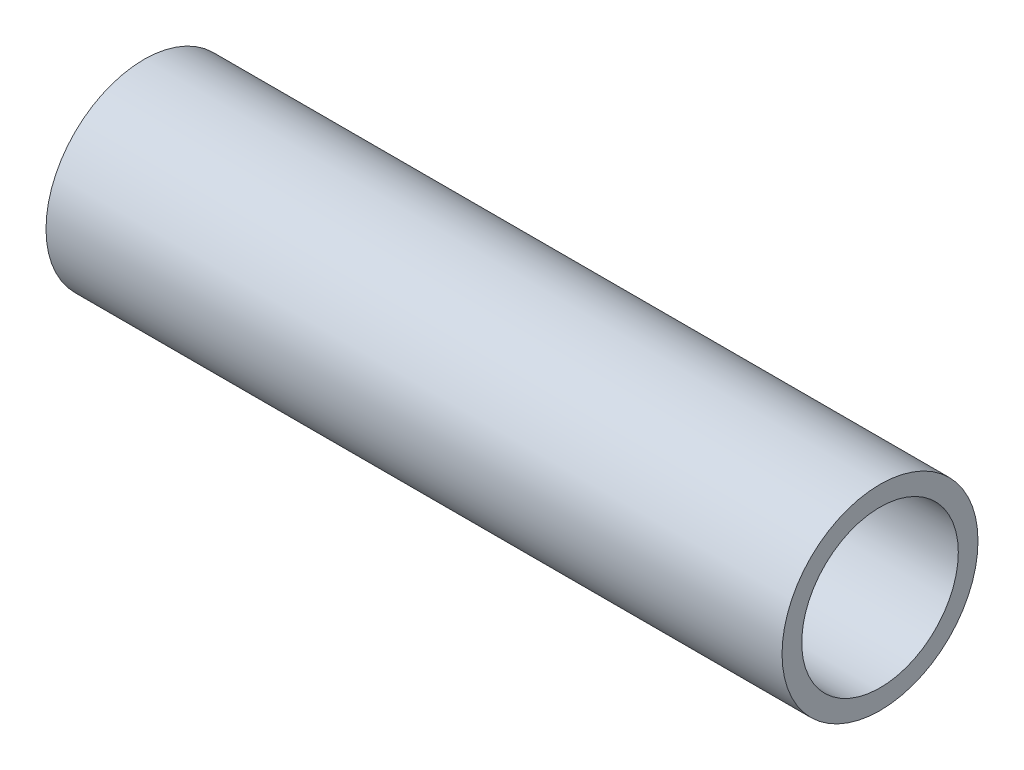
ISO-10303-21;
HEADER;
FILE_DESCRIPTION(('STEP AP214'),'2;1');
FILE_NAME('part.step','',(''),(''),'','','');
FILE_SCHEMA(('AUTOMOTIVE_DESIGN { 1 0 10303 214 1 1 1 1 }'));
ENDSEC;
DATA;
#1=APPLICATION_CONTEXT('core data for automotive mechanical design processes');
#2=APPLICATION_PROTOCOL_DEFINITION('international standard','automotive_design',2000,#1);
#3=PRODUCT_CONTEXT('',#1,'mechanical');
#4=PRODUCT('Part','Part','',(#3));
#5=PRODUCT_RELATED_PRODUCT_CATEGORY('part','',(#4));
#6=PRODUCT_DEFINITION_FORMATION('','',#4);
#7=PRODUCT_DEFINITION_CONTEXT('part definition',#1,'design');
#8=PRODUCT_DEFINITION('design','',#6,#7);
#9=PRODUCT_DEFINITION_SHAPE('','',#8);
#10=(LENGTH_UNIT() NAMED_UNIT(*) SI_UNIT(.MILLI.,.METRE.));
#11=(NAMED_UNIT(*) PLANE_ANGLE_UNIT() SI_UNIT($,.RADIAN.));
#12=(NAMED_UNIT(*) SI_UNIT($,.STERADIAN.) SOLID_ANGLE_UNIT());
#13=UNCERTAINTY_MEASURE_WITH_UNIT(LENGTH_MEASURE(1.E-05),#10,'distance_accuracy_value','');
#14=(GEOMETRIC_REPRESENTATION_CONTEXT(3) GLOBAL_UNCERTAINTY_ASSIGNED_CONTEXT((#13)) GLOBAL_UNIT_ASSIGNED_CONTEXT((#10,
#11,#12)) REPRESENTATION_CONTEXT('',''));
#15=CARTESIAN_POINT('',(0.,0.,0.));
#16=DIRECTION('',(0.,0.,1.));
#17=DIRECTION('',(1.,0.,0.));
#18=AXIS2_PLACEMENT_3D('',#15,#16,#17);
#19=CARTESIAN_POINT('',(80.,0.,0.));
#20=DIRECTION('',(1.,0.,0.));
#21=DIRECTION('',(0.,0.,-1.));
#22=AXIS2_PLACEMENT_3D('',#19,#20,#21);
#23=PLANE('',#22);
#24=CARTESIAN_POINT('',(80.,0.,0.));
#25=DIRECTION('',(1.,0.,0.));
#26=DIRECTION('',(0.,0.,-1.));
#27=AXIS2_PLACEMENT_3D('',#24,#25,#26);
#28=CIRCLE('',#27,10.65);
#29=CARTESIAN_POINT('',(80.,0.,-10.65));
#30=VERTEX_POINT('',#29);
#31=EDGE_CURVE('E10',#30,#30,#28,.T.);
#32=ORIENTED_EDGE('',*,*,#31,.T.);
#33=EDGE_LOOP('',(#32));
#34=FACE_BOUND('',#33,.T.);
#35=CARTESIAN_POINT('',(80.,0.,0.));
#36=DIRECTION('',(1.,0.,0.));
#37=DIRECTION('',(0.,0.,-1.));
#38=AXIS2_PLACEMENT_3D('',#35,#36,#37);
#39=CIRCLE('',#38,8.51);
#40=CARTESIAN_POINT('',(80.,0.,-8.51000000000001));
#41=VERTEX_POINT('',#40);
#42=EDGE_CURVE('E46',#41,#41,#39,.T.);
#43=ORIENTED_EDGE('',*,*,#42,.F.);
#44=EDGE_LOOP('',(#43));
#45=FACE_BOUND('',#44,.T.);
#46=ADVANCED_FACE('F32',(#34,#45),#23,.T.);
#47=CARTESIAN_POINT('',(0.,0.,0.));
#48=DIRECTION('',(1.,0.,0.));
#49=DIRECTION('',(0.,0.,-1.));
#50=AXIS2_PLACEMENT_3D('',#47,#48,#49);
#51=PLANE('',#50);
#52=CARTESIAN_POINT('',(0.,0.,0.));
#53=DIRECTION('',(1.,0.,0.));
#54=DIRECTION('',(0.,0.,-1.));
#55=AXIS2_PLACEMENT_3D('',#52,#53,#54);
#56=CIRCLE('',#55,10.65);
#57=CARTESIAN_POINT('',(0.,0.,-10.65));
#58=VERTEX_POINT('',#57);
#59=EDGE_CURVE('E36',#58,#58,#56,.T.);
#60=ORIENTED_EDGE('',*,*,#59,.F.);
#61=EDGE_LOOP('',(#60));
#62=FACE_BOUND('',#61,.T.);
#63=CARTESIAN_POINT('',(0.,0.,0.));
#64=DIRECTION('',(1.,0.,0.));
#65=DIRECTION('',(0.,0.,-1.));
#66=AXIS2_PLACEMENT_3D('',#63,#64,#65);
#67=CIRCLE('',#66,8.51);
#68=CARTESIAN_POINT('',(0.,0.,-8.51000000000001));
#69=VERTEX_POINT('',#68);
#70=EDGE_CURVE('E48',#69,#69,#67,.T.);
#71=ORIENTED_EDGE('',*,*,#70,.T.);
#72=EDGE_LOOP('',(#71));
#73=FACE_BOUND('',#72,.T.);
#74=ADVANCED_FACE('F61',(#62,#73),#51,.F.);
#75=CARTESIAN_POINT('',(80.,0.,0.));
#76=DIRECTION('',(-1.,0.,0.));
#77=DIRECTION('',(0.,0.,1.));
#78=AXIS2_PLACEMENT_3D('',#75,#76,#77);
#79=CYLINDRICAL_SURFACE('',#78,10.65);
#80=ORIENTED_EDGE('',*,*,#31,.F.);
#81=EDGE_LOOP('',(#80));
#82=FACE_BOUND('',#81,.T.);
#83=ORIENTED_EDGE('',*,*,#59,.T.);
#84=EDGE_LOOP('',(#83));
#85=FACE_BOUND('',#84,.T.);
#86=ADVANCED_FACE('F34',(#82,#85),#79,.T.);
#87=CARTESIAN_POINT('',(80.,0.,0.));
#88=DIRECTION('',(-1.,0.,0.));
#89=DIRECTION('',(0.,0.,1.));
#90=AXIS2_PLACEMENT_3D('',#87,#88,#89);
#91=CYLINDRICAL_SURFACE('',#90,8.51);
#92=ORIENTED_EDGE('',*,*,#42,.T.);
#93=EDGE_LOOP('',(#92));
#94=FACE_BOUND('',#93,.T.);
#95=ORIENTED_EDGE('',*,*,#70,.F.);
#96=EDGE_LOOP('',(#95));
#97=FACE_BOUND('',#96,.T.);
#98=ADVANCED_FACE('F57',(#94,#97),#91,.F.);
#99=CLOSED_SHELL('',(#46,#74,#86,#98));
#100=MANIFOLD_SOLID_BREP('B2',#99);
#101=ADVANCED_BREP_SHAPE_REPRESENTATION('',(#18,#100),#14);
#102=SHAPE_DEFINITION_REPRESENTATION(#9,#101);
ENDSEC;
END-ISO-10303-21;
